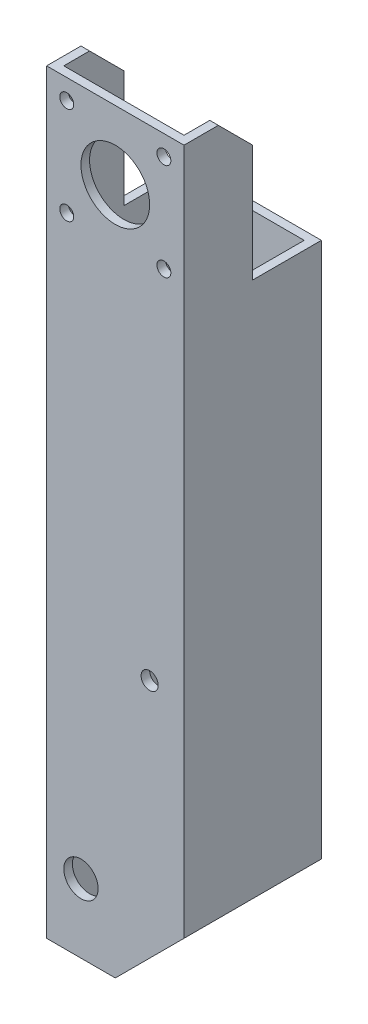
ISO-10303-21;
HEADER;
FILE_DESCRIPTION(('STEP AP214'),'2;1');
FILE_NAME('part.step','',(''),(''),'','','');
FILE_SCHEMA(('AUTOMOTIVE_DESIGN { 1 0 10303 214 1 1 1 1 }'));
ENDSEC;
DATA;
#1=APPLICATION_CONTEXT('core data for automotive mechanical design processes');
#2=APPLICATION_PROTOCOL_DEFINITION('international standard','automotive_design',2000,#1);
#3=PRODUCT_CONTEXT('',#1,'mechanical');
#4=PRODUCT('Part','Part','',(#3));
#5=PRODUCT_RELATED_PRODUCT_CATEGORY('part','',(#4));
#6=PRODUCT_DEFINITION_FORMATION('','',#4);
#7=PRODUCT_DEFINITION_CONTEXT('part definition',#1,'design');
#8=PRODUCT_DEFINITION('design','',#6,#7);
#9=PRODUCT_DEFINITION_SHAPE('','',#8);
#10=(LENGTH_UNIT() NAMED_UNIT(*) SI_UNIT(.MILLI.,.METRE.));
#11=(NAMED_UNIT(*) PLANE_ANGLE_UNIT() SI_UNIT($,.RADIAN.));
#12=(NAMED_UNIT(*) SI_UNIT($,.STERADIAN.) SOLID_ANGLE_UNIT());
#13=UNCERTAINTY_MEASURE_WITH_UNIT(LENGTH_MEASURE(1.E-05),#10,'distance_accuracy_value','');
#14=(GEOMETRIC_REPRESENTATION_CONTEXT(3) GLOBAL_UNCERTAINTY_ASSIGNED_CONTEXT((#13)) GLOBAL_UNIT_ASSIGNED_CONTEXT((#10,
#11,#12)) REPRESENTATION_CONTEXT('',''));
#15=CARTESIAN_POINT('',(0.,0.,0.));
#16=DIRECTION('',(0.,0.,1.));
#17=DIRECTION('',(1.,0.,0.));
#18=AXIS2_PLACEMENT_3D('',#15,#16,#17);
#19=CARTESIAN_POINT('',(0.,279.4,0.));
#20=DIRECTION('',(0.,-1.,0.));
#21=DIRECTION('',(0.,0.,-1.));
#22=AXIS2_PLACEMENT_3D('',#19,#20,#21);
#23=PLANE('',#22);
#24=DIRECTION('',(0.,0.,-1.));
#25=VECTOR('',#24,1.);
#26=CARTESIAN_POINT('',(50.8,279.4,0.));
#27=LINE('',#26,#25);
#28=CARTESIAN_POINT('',(50.8,279.4,0.));
#29=VERTEX_POINT('',#28);
#30=CARTESIAN_POINT('',(50.8,279.4,-12.7));
#31=VERTEX_POINT('',#30);
#32=EDGE_CURVE('E176',#29,#31,#27,.T.);
#33=ORIENTED_EDGE('',*,*,#32,.T.);
#34=DIRECTION('',(-1.,0.,0.));
#35=VECTOR('',#34,1.);
#36=CARTESIAN_POINT('',(0.,279.4,-12.7));
#37=LINE('',#36,#35);
#38=CARTESIAN_POINT('',(47.625,279.4,-12.7));
#39=VERTEX_POINT('',#38);
#40=EDGE_CURVE('E215',#31,#39,#37,.T.);
#41=ORIENTED_EDGE('',*,*,#40,.T.);
#42=DIRECTION('',(0.,0.,-1.));
#43=VECTOR('',#42,1.);
#44=CARTESIAN_POINT('',(47.625,279.4,-3.175));
#45=LINE('',#44,#43);
#46=CARTESIAN_POINT('',(47.625,279.4,-3.175));
#47=VERTEX_POINT('',#46);
#48=EDGE_CURVE('E245',#47,#39,#45,.T.);
#49=ORIENTED_EDGE('',*,*,#48,.F.);
#50=DIRECTION('',(1.,0.,0.));
#51=VECTOR('',#50,1.);
#52=CARTESIAN_POINT('',(3.175,279.4,-3.175));
#53=LINE('',#52,#51);
#54=CARTESIAN_POINT('',(3.175,279.4,-3.175));
#55=VERTEX_POINT('',#54);
#56=EDGE_CURVE('E275',#55,#47,#53,.T.);
#57=ORIENTED_EDGE('',*,*,#56,.F.);
#58=DIRECTION('',(0.,0.,1.));
#59=VECTOR('',#58,1.);
#60=CARTESIAN_POINT('',(3.175,279.4,-3.175));
#61=LINE('',#60,#59);
#62=CARTESIAN_POINT('',(3.175,279.4,-12.7));
#63=VERTEX_POINT('',#62);
#64=EDGE_CURVE('E279',#63,#55,#61,.T.);
#65=ORIENTED_EDGE('',*,*,#64,.F.);
#66=DIRECTION('',(-1.,0.,0.));
#67=VECTOR('',#66,1.);
#68=CARTESIAN_POINT('',(0.,279.4,-12.7));
#69=LINE('',#68,#67);
#70=CARTESIAN_POINT('',(0.,279.4,-12.7));
#71=VERTEX_POINT('',#70);
#72=EDGE_CURVE('E212',#63,#71,#69,.T.);
#73=ORIENTED_EDGE('',*,*,#72,.T.);
#74=DIRECTION('',(0.,0.,1.));
#75=VECTOR('',#74,1.);
#76=CARTESIAN_POINT('',(0.,279.4,0.));
#77=LINE('',#76,#75);
#78=CARTESIAN_POINT('',(0.,279.4,0.));
#79=VERTEX_POINT('',#78);
#80=EDGE_CURVE('E299',#71,#79,#77,.T.);
#81=ORIENTED_EDGE('',*,*,#80,.T.);
#82=DIRECTION('',(1.,0.,0.));
#83=VECTOR('',#82,1.);
#84=CARTESIAN_POINT('',(0.,279.4,0.));
#85=LINE('',#84,#83);
#86=EDGE_CURVE('E234',#79,#29,#85,.T.);
#87=ORIENTED_EDGE('',*,*,#86,.T.);
#88=EDGE_LOOP('',(#33,#41,#49,#57,#65,#73,#81,#87));
#89=FACE_BOUND('',#88,.T.);
#90=ADVANCED_FACE('F32',(#89),#23,.F.);
#91=CARTESIAN_POINT('',(0.,0.,0.));
#92=DIRECTION('',(0.,-1.,0.));
#93=DIRECTION('',(0.,0.,-1.));
#94=AXIS2_PLACEMENT_3D('',#91,#92,#93);
#95=PLANE('',#94);
#96=DIRECTION('',(-1.,0.,0.));
#97=VECTOR('',#96,1.);
#98=CARTESIAN_POINT('',(0.,0.,-50.8));
#99=LINE('',#98,#97);
#100=CARTESIAN_POINT('',(25.3999999999998,0.,-50.8));
#101=VERTEX_POINT('',#100);
#102=CARTESIAN_POINT('',(0.,0.,-50.8));
#103=VERTEX_POINT('',#102);
#104=EDGE_CURVE('E301',#101,#103,#99,.T.);
#105=ORIENTED_EDGE('',*,*,#104,.F.);
#106=DIRECTION('',(0.,0.,1.));
#107=VECTOR('',#106,1.);
#108=CARTESIAN_POINT('',(25.3999999999998,0.,0.));
#109=LINE('',#108,#107);
#110=CARTESIAN_POINT('',(25.3999999999998,0.,-47.625));
#111=VERTEX_POINT('',#110);
#112=EDGE_CURVE('E192',#101,#111,#109,.T.);
#113=ORIENTED_EDGE('',*,*,#112,.T.);
#114=DIRECTION('',(-1.,0.,0.));
#115=VECTOR('',#114,1.);
#116=CARTESIAN_POINT('',(3.175,0.,-47.625));
#117=LINE('',#116,#115);
#118=CARTESIAN_POINT('',(3.175,0.,-47.625));
#119=VERTEX_POINT('',#118);
#120=EDGE_CURVE('E284',#111,#119,#117,.T.);
#121=ORIENTED_EDGE('',*,*,#120,.T.);
#122=DIRECTION('',(0.,0.,1.));
#123=VECTOR('',#122,1.);
#124=CARTESIAN_POINT('',(3.175,0.,-3.175));
#125=LINE('',#124,#123);
#126=CARTESIAN_POINT('',(3.175,0.,-3.175));
#127=VERTEX_POINT('',#126);
#128=EDGE_CURVE('E277',#119,#127,#125,.T.);
#129=ORIENTED_EDGE('',*,*,#128,.T.);
#130=DIRECTION('',(1.,0.,0.));
#131=VECTOR('',#130,1.);
#132=CARTESIAN_POINT('',(3.175,0.,-3.175));
#133=LINE('',#132,#131);
#134=CARTESIAN_POINT('',(25.3999999999998,0.,-3.175));
#135=VERTEX_POINT('',#134);
#136=EDGE_CURVE('E274',#127,#135,#133,.T.);
#137=ORIENTED_EDGE('',*,*,#136,.T.);
#138=DIRECTION('',(0.,0.,1.));
#139=VECTOR('',#138,1.);
#140=CARTESIAN_POINT('',(25.3999999999998,0.,0.));
#141=LINE('',#140,#139);
#142=CARTESIAN_POINT('',(25.3999999999998,0.,0.));
#143=VERTEX_POINT('',#142);
#144=EDGE_CURVE('E190',#135,#143,#141,.T.);
#145=ORIENTED_EDGE('',*,*,#144,.T.);
#146=DIRECTION('',(1.,0.,0.));
#147=VECTOR('',#146,1.);
#148=CARTESIAN_POINT('',(0.,0.,0.));
#149=LINE('',#148,#147);
#150=CARTESIAN_POINT('',(0.,0.,0.));
#151=VERTEX_POINT('',#150);
#152=EDGE_CURVE('E305',#151,#143,#149,.T.);
#153=ORIENTED_EDGE('',*,*,#152,.F.);
#154=DIRECTION('',(0.,0.,1.));
#155=VECTOR('',#154,1.);
#156=CARTESIAN_POINT('',(0.,0.,0.));
#157=LINE('',#156,#155);
#158=EDGE_CURVE('E298',#103,#151,#157,.T.);
#159=ORIENTED_EDGE('',*,*,#158,.F.);
#160=EDGE_LOOP('',(#105,#113,#121,#129,#137,#145,#153,#159));
#161=FACE_BOUND('',#160,.T.);
#162=ADVANCED_FACE('F311',(#161),#95,.T.);
#163=CARTESIAN_POINT('',(0.,279.4,0.));
#164=DIRECTION('',(1.,0.,0.));
#165=DIRECTION('',(0.,0.,-1.));
#166=AXIS2_PLACEMENT_3D('',#163,#164,#165);
#167=PLANE('',#166);
#168=ORIENTED_EDGE('',*,*,#80,.F.);
#169=DIRECTION('',(0.,0.707106781186549,0.707106781186546));
#170=VECTOR('',#169,1.);
#171=CARTESIAN_POINT('',(0.,279.4,-12.7));
#172=LINE('',#171,#170);
#173=CARTESIAN_POINT('',(0.,266.7,-25.4));
#174=VERTEX_POINT('',#173);
#175=EDGE_CURVE('E54',#71,#174,#172,.F.);
#176=ORIENTED_EDGE('',*,*,#175,.T.);
#177=DIRECTION('',(0.,1.,0.));
#178=VECTOR('',#177,1.);
#179=CARTESIAN_POINT('',(0.,279.4,-25.4));
#180=LINE('',#179,#178);
#181=CARTESIAN_POINT('',(0.,223.52,-25.4));
#182=VERTEX_POINT('',#181);
#183=EDGE_CURVE('E156',#182,#174,#180,.T.);
#184=ORIENTED_EDGE('',*,*,#183,.F.);
#185=DIRECTION('',(0.,0.,1.));
#186=VECTOR('',#185,1.);
#187=CARTESIAN_POINT('',(0.,223.52,-50.8));
#188=LINE('',#187,#186);
#189=CARTESIAN_POINT('',(0.,223.52,-50.8));
#190=VERTEX_POINT('',#189);
#191=EDGE_CURVE('E314',#190,#182,#188,.T.);
#192=ORIENTED_EDGE('',*,*,#191,.F.);
#193=DIRECTION('',(0.,-1.,0.));
#194=VECTOR('',#193,1.);
#195=CARTESIAN_POINT('',(0.,279.4,-50.8));
#196=LINE('',#195,#194);
#197=EDGE_CURVE('E164',#190,#103,#196,.T.);
#198=ORIENTED_EDGE('',*,*,#197,.T.);
#199=ORIENTED_EDGE('',*,*,#158,.T.);
#200=DIRECTION('',(0.,-1.,0.));
#201=VECTOR('',#200,1.);
#202=CARTESIAN_POINT('',(0.,279.4,0.));
#203=LINE('',#202,#201);
#204=EDGE_CURVE('E174',#79,#151,#203,.T.);
#205=ORIENTED_EDGE('',*,*,#204,.F.);
#206=EDGE_LOOP('',(#168,#176,#184,#192,#198,#199,#205));
#207=FACE_BOUND('',#206,.T.);
#208=ADVANCED_FACE('F313',(#207),#167,.F.);
#209=CARTESIAN_POINT('',(0.,279.4,0.));
#210=DIRECTION('',(0.,0.,-1.));
#211=DIRECTION('',(-1.,0.,0.));
#212=AXIS2_PLACEMENT_3D('',#209,#210,#211);
#213=PLANE('',#212);
#214=CARTESIAN_POINT('',(7.43948775786172,236.039487757862,0.));
#215=DIRECTION('',(0.,0.,1.));
#216=DIRECTION('',(1.,0.,0.));
#217=AXIS2_PLACEMENT_3D('',#214,#215,#216);
#218=CIRCLE('',#217,2.5796875);
#219=CARTESIAN_POINT('',(10.0191752578617,236.039487757862,0.));
#220=VERTEX_POINT('',#219);
#221=EDGE_CURVE('E415',#220,#220,#218,.T.);
#222=ORIENTED_EDGE('',*,*,#221,.F.);
#223=EDGE_LOOP('',(#222));
#224=FACE_BOUND('',#223,.T.);
#225=CARTESIAN_POINT('',(43.3605122421383,236.039487757862,0.));
#226=DIRECTION('',(0.,0.,1.));
#227=DIRECTION('',(1.,0.,0.));
#228=AXIS2_PLACEMENT_3D('',#225,#226,#227);
#229=CIRCLE('',#228,2.57968749999999);
#230=CARTESIAN_POINT('',(45.9401997421383,236.039487757862,0.));
#231=VERTEX_POINT('',#230);
#232=EDGE_CURVE('E419',#231,#231,#229,.T.);
#233=ORIENTED_EDGE('',*,*,#232,.F.);
#234=EDGE_LOOP('',(#233));
#235=FACE_BOUND('',#234,.T.);
#236=CARTESIAN_POINT('',(43.3605122421384,271.960512242138,0.));
#237=DIRECTION('',(0.,0.,1.));
#238=DIRECTION('',(1.,0.,0.));
#239=AXIS2_PLACEMENT_3D('',#236,#237,#238);
#240=CIRCLE('',#239,2.57968749999999);
#241=CARTESIAN_POINT('',(45.9401997421384,271.960512242138,0.));
#242=VERTEX_POINT('',#241);
#243=EDGE_CURVE('E427',#242,#242,#240,.T.);
#244=ORIENTED_EDGE('',*,*,#243,.F.);
#245=EDGE_LOOP('',(#244));
#246=FACE_BOUND('',#245,.T.);
#247=CARTESIAN_POINT('',(7.43948775786173,271.960512242138,0.));
#248=DIRECTION('',(0.,0.,1.));
#249=DIRECTION('',(1.,0.,0.));
#250=AXIS2_PLACEMENT_3D('',#247,#248,#249);
#251=CIRCLE('',#250,2.5796875);
#252=CARTESIAN_POINT('',(10.0191752578617,271.960512242138,0.));
#253=VERTEX_POINT('',#252);
#254=EDGE_CURVE('E316',#253,#253,#251,.T.);
#255=ORIENTED_EDGE('',*,*,#254,.F.);
#256=EDGE_LOOP('',(#255));
#257=FACE_BOUND('',#256,.T.);
#258=CARTESIAN_POINT('',(38.1,101.6,0.));
#259=DIRECTION('',(0.,0.,-1.));
#260=DIRECTION('',(-1.,0.,0.));
#261=AXIS2_PLACEMENT_3D('',#258,#259,#260);
#262=CIRCLE('',#261,3.175);
#263=CARTESIAN_POINT('',(34.925,101.6,0.));
#264=VERTEX_POINT('',#263);
#265=EDGE_CURVE('E208',#264,#264,#262,.T.);
#266=ORIENTED_EDGE('',*,*,#265,.T.);
#267=EDGE_LOOP('',(#266));
#268=FACE_BOUND('',#267,.T.);
#269=CARTESIAN_POINT('',(25.4,254.,0.));
#270=DIRECTION('',(0.,0.,-1.));
#271=DIRECTION('',(-1.,0.,0.));
#272=AXIS2_PLACEMENT_3D('',#269,#270,#271);
#273=CIRCLE('',#272,12.7);
#274=CARTESIAN_POINT('',(12.7,254.,0.));
#275=VERTEX_POINT('',#274);
#276=EDGE_CURVE('E261',#275,#275,#273,.T.);
#277=ORIENTED_EDGE('',*,*,#276,.T.);
#278=EDGE_LOOP('',(#277));
#279=FACE_BOUND('',#278,.T.);
#280=CARTESIAN_POINT('',(12.7,25.4,0.));
#281=DIRECTION('',(0.,0.,-1.));
#282=DIRECTION('',(-1.,0.,0.));
#283=AXIS2_PLACEMENT_3D('',#280,#281,#282);
#284=CIRCLE('',#283,6.35);
#285=CARTESIAN_POINT('',(6.34999999999999,25.4,0.));
#286=VERTEX_POINT('',#285);
#287=EDGE_CURVE('E186',#286,#286,#284,.T.);
#288=ORIENTED_EDGE('',*,*,#287,.T.);
#289=EDGE_LOOP('',(#288));
#290=FACE_BOUND('',#289,.T.);
#291=ORIENTED_EDGE('',*,*,#152,.T.);
#292=DIRECTION('',(0.707106781186544,0.707106781186551,0.));
#293=VECTOR('',#292,1.);
#294=CARTESIAN_POINT('',(50.8,25.4000000000004,0.));
#295=LINE('',#294,#293);
#296=CARTESIAN_POINT('',(50.8,25.4000000000004,0.));
#297=VERTEX_POINT('',#296);
#298=EDGE_CURVE('E201',#143,#297,#295,.T.);
#299=ORIENTED_EDGE('',*,*,#298,.T.);
#300=DIRECTION('',(0.,-1.,0.));
#301=VECTOR('',#300,1.);
#302=CARTESIAN_POINT('',(50.8,279.4,0.));
#303=LINE('',#302,#301);
#304=EDGE_CURVE('E172',#29,#297,#303,.T.);
#305=ORIENTED_EDGE('',*,*,#304,.F.);
#306=ORIENTED_EDGE('',*,*,#86,.F.);
#307=ORIENTED_EDGE('',*,*,#204,.T.);
#308=EDGE_LOOP('',(#291,#299,#305,#306,#307));
#309=FACE_BOUND('',#308,.T.);
#310=ADVANCED_FACE('F374',(#224,#235,#246,#257,#268,#279,#290,#309),#213,.F.);
#311=CARTESIAN_POINT('',(50.8,279.4,0.));
#312=DIRECTION('',(-1.,0.,0.));
#313=DIRECTION('',(0.,0.,1.));
#314=AXIS2_PLACEMENT_3D('',#311,#312,#313);
#315=PLANE('',#314);
#316=DIRECTION('',(0.,1.,0.));
#317=VECTOR('',#316,1.);
#318=CARTESIAN_POINT('',(50.8,279.4,-25.4));
#319=LINE('',#318,#317);
#320=CARTESIAN_POINT('',(50.8,223.52,-25.4));
#321=VERTEX_POINT('',#320);
#322=CARTESIAN_POINT('',(50.8,266.7,-25.4));
#323=VERTEX_POINT('',#322);
#324=EDGE_CURVE('E155',#321,#323,#319,.T.);
#325=ORIENTED_EDGE('',*,*,#324,.T.);
#326=DIRECTION('',(0.,-0.707106781186549,-0.707106781186546));
#327=VECTOR('',#326,1.);
#328=CARTESIAN_POINT('',(50.8,279.4,-12.7));
#329=LINE('',#328,#327);
#330=EDGE_CURVE('E222',#323,#31,#329,.F.);
#331=ORIENTED_EDGE('',*,*,#330,.T.);
#332=ORIENTED_EDGE('',*,*,#32,.F.);
#333=ORIENTED_EDGE('',*,*,#304,.T.);
#334=DIRECTION('',(0.,0.,-1.));
#335=VECTOR('',#334,1.);
#336=CARTESIAN_POINT('',(50.8,25.4000000000004,-50.8));
#337=LINE('',#336,#335);
#338=CARTESIAN_POINT('',(50.8,25.4000000000004,-50.8));
#339=VERTEX_POINT('',#338);
#340=EDGE_CURVE('E171',#297,#339,#337,.T.);
#341=ORIENTED_EDGE('',*,*,#340,.T.);
#342=DIRECTION('',(0.,-1.,0.));
#343=VECTOR('',#342,1.);
#344=CARTESIAN_POINT('',(50.8,279.4,-50.8));
#345=LINE('',#344,#343);
#346=CARTESIAN_POINT('',(50.8,223.52,-50.8));
#347=VERTEX_POINT('',#346);
#348=EDGE_CURVE('E161',#347,#339,#345,.T.);
#349=ORIENTED_EDGE('',*,*,#348,.F.);
#350=DIRECTION('',(0.,0.,1.));
#351=VECTOR('',#350,1.);
#352=CARTESIAN_POINT('',(50.8,223.52,-50.8));
#353=LINE('',#352,#351);
#354=EDGE_CURVE('E143',#347,#321,#353,.T.);
#355=ORIENTED_EDGE('',*,*,#354,.T.);
#356=EDGE_LOOP('',(#325,#331,#332,#333,#341,#349,#355));
#357=FACE_BOUND('',#356,.T.);
#358=ADVANCED_FACE('F168',(#357),#315,.F.);
#359=CARTESIAN_POINT('',(0.,279.4,-50.8));
#360=DIRECTION('',(0.,0.,1.));
#361=DIRECTION('',(1.,0.,0.));
#362=AXIS2_PLACEMENT_3D('',#359,#360,#361);
#363=PLANE('',#362);
#364=CARTESIAN_POINT('',(38.1,101.6,-50.8));
#365=DIRECTION('',(0.,0.,-1.));
#366=DIRECTION('',(-1.,0.,0.));
#367=AXIS2_PLACEMENT_3D('',#364,#365,#366);
#368=CIRCLE('',#367,3.175);
#369=CARTESIAN_POINT('',(34.925,101.6,-50.8));
#370=VERTEX_POINT('',#369);
#371=EDGE_CURVE('E248',#370,#370,#368,.T.);
#372=ORIENTED_EDGE('',*,*,#371,.F.);
#373=EDGE_LOOP('',(#372));
#374=FACE_BOUND('',#373,.T.);
#375=CARTESIAN_POINT('',(12.7,25.4,-50.8));
#376=DIRECTION('',(0.,0.,-1.));
#377=DIRECTION('',(-1.,0.,0.));
#378=AXIS2_PLACEMENT_3D('',#375,#376,#377);
#379=CIRCLE('',#378,6.35);
#380=CARTESIAN_POINT('',(6.34999999999999,25.4,-50.8));
#381=VERTEX_POINT('',#380);
#382=EDGE_CURVE('E267',#381,#381,#379,.T.);
#383=ORIENTED_EDGE('',*,*,#382,.F.);
#384=EDGE_LOOP('',(#383));
#385=FACE_BOUND('',#384,.T.);
#386=ORIENTED_EDGE('',*,*,#197,.F.);
#387=DIRECTION('',(-1.,0.,0.));
#388=VECTOR('',#387,1.);
#389=CARTESIAN_POINT('',(50.8,223.52,-50.8));
#390=LINE('',#389,#388);
#391=EDGE_CURVE('E147',#347,#190,#390,.T.);
#392=ORIENTED_EDGE('',*,*,#391,.F.);
#393=ORIENTED_EDGE('',*,*,#348,.T.);
#394=DIRECTION('',(-0.707106781186544,-0.707106781186551,0.));
#395=VECTOR('',#394,1.);
#396=CARTESIAN_POINT('',(50.8,25.4000000000004,-50.8));
#397=LINE('',#396,#395);
#398=EDGE_CURVE('E188',#339,#101,#397,.T.);
#399=ORIENTED_EDGE('',*,*,#398,.T.);
#400=ORIENTED_EDGE('',*,*,#104,.T.);
#401=EDGE_LOOP('',(#386,#392,#393,#399,#400));
#402=FACE_BOUND('',#401,.T.);
#403=ADVANCED_FACE('F160',(#374,#385,#402),#363,.F.);
#404=CARTESIAN_POINT('',(3.175,279.4,-3.175));
#405=DIRECTION('',(0.,0.,-1.));
#406=DIRECTION('',(-1.,0.,0.));
#407=AXIS2_PLACEMENT_3D('',#404,#405,#406);
#408=PLANE('',#407);
#409=CARTESIAN_POINT('',(7.43948775786172,236.039487757862,-3.175));
#410=DIRECTION('',(0.,0.,-1.));
#411=DIRECTION('',(-1.,0.,0.));
#412=AXIS2_PLACEMENT_3D('',#409,#410,#411);
#413=CIRCLE('',#412,2.5796875);
#414=CARTESIAN_POINT('',(4.85980025786172,236.039487757862,-3.175));
#415=VERTEX_POINT('',#414);
#416=EDGE_CURVE('E412',#415,#415,#413,.F.);
#417=ORIENTED_EDGE('',*,*,#416,.T.);
#418=EDGE_LOOP('',(#417));
#419=FACE_BOUND('',#418,.T.);
#420=CARTESIAN_POINT('',(43.3605122421383,236.039487757862,-3.175));
#421=DIRECTION('',(0.,0.,-1.));
#422=DIRECTION('',(-1.,0.,0.));
#423=AXIS2_PLACEMENT_3D('',#420,#421,#422);
#424=CIRCLE('',#423,2.57968749999999);
#425=CARTESIAN_POINT('',(40.7808247421383,236.039487757862,-3.175));
#426=VERTEX_POINT('',#425);
#427=EDGE_CURVE('E424',#426,#426,#424,.F.);
#428=ORIENTED_EDGE('',*,*,#427,.T.);
#429=EDGE_LOOP('',(#428));
#430=FACE_BOUND('',#429,.T.);
#431=CARTESIAN_POINT('',(43.3605122421384,271.960512242138,-3.175));
#432=DIRECTION('',(0.,0.,-1.));
#433=DIRECTION('',(-1.,0.,0.));
#434=AXIS2_PLACEMENT_3D('',#431,#432,#433);
#435=CIRCLE('',#434,2.57968749999999);
#436=CARTESIAN_POINT('',(40.7808247421384,271.960512242138,-3.175));
#437=VERTEX_POINT('',#436);
#438=EDGE_CURVE('E430',#437,#437,#435,.F.);
#439=ORIENTED_EDGE('',*,*,#438,.T.);
#440=EDGE_LOOP('',(#439));
#441=FACE_BOUND('',#440,.T.);
#442=CARTESIAN_POINT('',(7.43948775786173,271.960512242138,-3.175));
#443=DIRECTION('',(0.,0.,-1.));
#444=DIRECTION('',(-1.,0.,0.));
#445=AXIS2_PLACEMENT_3D('',#442,#443,#444);
#446=CIRCLE('',#445,2.5796875);
#447=CARTESIAN_POINT('',(4.85980025786174,271.960512242138,-3.175));
#448=VERTEX_POINT('',#447);
#449=EDGE_CURVE('E320',#448,#448,#446,.F.);
#450=ORIENTED_EDGE('',*,*,#449,.T.);
#451=EDGE_LOOP('',(#450));
#452=FACE_BOUND('',#451,.T.);
#453=CARTESIAN_POINT('',(38.1,101.6,-3.175));
#454=DIRECTION('',(0.,0.,-1.));
#455=DIRECTION('',(-1.,0.,0.));
#456=AXIS2_PLACEMENT_3D('',#453,#454,#455);
#457=CIRCLE('',#456,3.175);
#458=CARTESIAN_POINT('',(34.925,101.6,-3.175));
#459=VERTEX_POINT('',#458);
#460=EDGE_CURVE('E207',#459,#459,#457,.T.);
#461=ORIENTED_EDGE('',*,*,#460,.F.);
#462=EDGE_LOOP('',(#461));
#463=FACE_BOUND('',#462,.T.);
#464=CARTESIAN_POINT('',(25.4,254.,-3.175));
#465=DIRECTION('',(0.,0.,-1.));
#466=DIRECTION('',(-1.,0.,0.));
#467=AXIS2_PLACEMENT_3D('',#464,#465,#466);
#468=CIRCLE('',#467,12.7);
#469=CARTESIAN_POINT('',(12.7,254.,-3.175));
#470=VERTEX_POINT('',#469);
#471=EDGE_CURVE('E264',#470,#470,#468,.T.);
#472=ORIENTED_EDGE('',*,*,#471,.F.);
#473=EDGE_LOOP('',(#472));
#474=FACE_BOUND('',#473,.T.);
#475=CARTESIAN_POINT('',(12.7,25.4,-3.175));
#476=DIRECTION('',(0.,0.,-1.));
#477=DIRECTION('',(-1.,0.,0.));
#478=AXIS2_PLACEMENT_3D('',#475,#476,#477);
#479=CIRCLE('',#478,6.35);
#480=CARTESIAN_POINT('',(6.34999999999999,25.4,-3.175));
#481=VERTEX_POINT('',#480);
#482=EDGE_CURVE('E185',#481,#481,#479,.T.);
#483=ORIENTED_EDGE('',*,*,#482,.F.);
#484=EDGE_LOOP('',(#483));
#485=FACE_BOUND('',#484,.T.);
#486=DIRECTION('',(0.,-1.,0.));
#487=VECTOR('',#486,1.);
#488=CARTESIAN_POINT('',(47.625,279.4,-3.175));
#489=LINE('',#488,#487);
#490=CARTESIAN_POINT('',(47.625,22.2250000000004,-3.175));
#491=VERTEX_POINT('',#490);
#492=EDGE_CURVE('E295',#47,#491,#489,.T.);
#493=ORIENTED_EDGE('',*,*,#492,.T.);
#494=DIRECTION('',(-0.707106781186544,-0.707106781186551,0.));
#495=VECTOR('',#494,1.);
#496=CARTESIAN_POINT('',(153.9875,128.587500000001,-3.175));
#497=LINE('',#496,#495);
#498=EDGE_CURVE('E199',#491,#135,#497,.T.);
#499=ORIENTED_EDGE('',*,*,#498,.T.);
#500=ORIENTED_EDGE('',*,*,#136,.F.);
#501=DIRECTION('',(0.,-1.,0.));
#502=VECTOR('',#501,1.);
#503=CARTESIAN_POINT('',(3.175,279.4,-3.175));
#504=LINE('',#503,#502);
#505=EDGE_CURVE('E281',#55,#127,#504,.T.);
#506=ORIENTED_EDGE('',*,*,#505,.F.);
#507=ORIENTED_EDGE('',*,*,#56,.T.);
#508=EDGE_LOOP('',(#493,#499,#500,#506,#507));
#509=FACE_BOUND('',#508,.T.);
#510=ADVANCED_FACE('F339',(#419,#430,#441,#452,#463,#474,#485,#509),#408,.T.);
#511=CARTESIAN_POINT('',(47.625,279.4,-3.175));
#512=DIRECTION('',(-1.,0.,0.));
#513=DIRECTION('',(0.,0.,1.));
#514=AXIS2_PLACEMENT_3D('',#511,#512,#513);
#515=PLANE('',#514);
#516=ORIENTED_EDGE('',*,*,#48,.T.);
#517=DIRECTION('',(0.,0.707106781186549,0.707106781186546));
#518=VECTOR('',#517,1.);
#519=CARTESIAN_POINT('',(47.625,284.1625,-7.93750000000003));
#520=LINE('',#519,#518);
#521=CARTESIAN_POINT('',(47.625,266.7,-25.4));
#522=VERTEX_POINT('',#521);
#523=EDGE_CURVE('E218',#39,#522,#520,.F.);
#524=ORIENTED_EDGE('',*,*,#523,.T.);
#525=DIRECTION('',(0.,1.,0.));
#526=VECTOR('',#525,1.);
#527=CARTESIAN_POINT('',(47.625,279.4,-25.4));
#528=LINE('',#527,#526);
#529=CARTESIAN_POINT('',(47.625,223.52,-25.4));
#530=VERTEX_POINT('',#529);
#531=EDGE_CURVE('E243',#530,#522,#528,.T.);
#532=ORIENTED_EDGE('',*,*,#531,.F.);
#533=DIRECTION('',(0.,0.,1.));
#534=VECTOR('',#533,1.);
#535=CARTESIAN_POINT('',(47.625,223.52,-3.175));
#536=LINE('',#535,#534);
#537=CARTESIAN_POINT('',(47.625,223.52,-47.625));
#538=VERTEX_POINT('',#537);
#539=EDGE_CURVE('E249',#538,#530,#536,.T.);
#540=ORIENTED_EDGE('',*,*,#539,.F.);
#541=DIRECTION('',(0.,-1.,0.));
#542=VECTOR('',#541,1.);
#543=CARTESIAN_POINT('',(47.625,279.4,-47.625));
#544=LINE('',#543,#542);
#545=CARTESIAN_POINT('',(47.625,22.2250000000004,-47.625));
#546=VERTEX_POINT('',#545);
#547=EDGE_CURVE('E293',#538,#546,#544,.T.);
#548=ORIENTED_EDGE('',*,*,#547,.T.);
#549=DIRECTION('',(0.,0.,1.));
#550=VECTOR('',#549,1.);
#551=CARTESIAN_POINT('',(47.625,22.2250000000004,-3.175));
#552=LINE('',#551,#550);
#553=EDGE_CURVE('E197',#546,#491,#552,.T.);
#554=ORIENTED_EDGE('',*,*,#553,.T.);
#555=ORIENTED_EDGE('',*,*,#492,.F.);
#556=EDGE_LOOP('',(#516,#524,#532,#540,#548,#554,#555));
#557=FACE_BOUND('',#556,.T.);
#558=ADVANCED_FACE('F241',(#557),#515,.T.);
#559=CARTESIAN_POINT('',(3.175,279.4,-47.625));
#560=DIRECTION('',(0.,0.,1.));
#561=DIRECTION('',(1.,0.,0.));
#562=AXIS2_PLACEMENT_3D('',#559,#560,#561);
#563=PLANE('',#562);
#564=DIRECTION('',(1.,0.,0.));
#565=VECTOR('',#564,1.);
#566=CARTESIAN_POINT('',(3.175,223.52,-47.625));
#567=LINE('',#566,#565);
#568=CARTESIAN_POINT('',(3.175,223.52,-47.625));
#569=VERTEX_POINT('',#568);
#570=EDGE_CURVE('E253',#569,#538,#567,.T.);
#571=ORIENTED_EDGE('',*,*,#570,.F.);
#572=DIRECTION('',(0.,-1.,0.));
#573=VECTOR('',#572,1.);
#574=CARTESIAN_POINT('',(3.175,279.4,-47.625));
#575=LINE('',#574,#573);
#576=EDGE_CURVE('E291',#569,#119,#575,.T.);
#577=ORIENTED_EDGE('',*,*,#576,.T.);
#578=ORIENTED_EDGE('',*,*,#120,.F.);
#579=DIRECTION('',(0.707106781186544,0.707106781186551,0.));
#580=VECTOR('',#579,1.);
#581=CARTESIAN_POINT('',(153.9875,128.587500000001,-47.625));
#582=LINE('',#581,#580);
#583=EDGE_CURVE('E194',#111,#546,#582,.T.);
#584=ORIENTED_EDGE('',*,*,#583,.T.);
#585=ORIENTED_EDGE('',*,*,#547,.F.);
#586=EDGE_LOOP('',(#571,#577,#578,#584,#585));
#587=FACE_BOUND('',#586,.T.);
#588=CARTESIAN_POINT('',(38.1,101.6,-47.625));
#589=DIRECTION('',(0.,0.,1.));
#590=DIRECTION('',(1.,0.,0.));
#591=AXIS2_PLACEMENT_3D('',#588,#589,#590);
#592=CIRCLE('',#591,3.175);
#593=CARTESIAN_POINT('',(41.275,101.6,-47.625));
#594=VERTEX_POINT('',#593);
#595=EDGE_CURVE('E204',#594,#594,#592,.T.);
#596=ORIENTED_EDGE('',*,*,#595,.F.);
#597=EDGE_LOOP('',(#596));
#598=FACE_BOUND('',#597,.T.);
#599=CARTESIAN_POINT('',(12.7,25.4,-47.625));
#600=DIRECTION('',(0.,0.,1.));
#601=DIRECTION('',(1.,0.,0.));
#602=AXIS2_PLACEMENT_3D('',#599,#600,#601);
#603=CIRCLE('',#602,6.35);
#604=CARTESIAN_POINT('',(19.05,25.4,-47.625));
#605=VERTEX_POINT('',#604);
#606=EDGE_CURVE('E182',#605,#605,#603,.T.);
#607=ORIENTED_EDGE('',*,*,#606,.F.);
#608=EDGE_LOOP('',(#607));
#609=FACE_BOUND('',#608,.T.);
#610=ADVANCED_FACE('F329',(#587,#598,#609),#563,.T.);
#611=CARTESIAN_POINT('',(3.175,279.4,-3.175));
#612=DIRECTION('',(1.,0.,0.));
#613=DIRECTION('',(0.,0.,-1.));
#614=AXIS2_PLACEMENT_3D('',#611,#612,#613);
#615=PLANE('',#614);
#616=DIRECTION('',(0.,-1.,0.));
#617=VECTOR('',#616,1.);
#618=CARTESIAN_POINT('',(3.175,279.4,-25.4));
#619=LINE('',#618,#617);
#620=CARTESIAN_POINT('',(3.175,266.7,-25.4));
#621=VERTEX_POINT('',#620);
#622=CARTESIAN_POINT('',(3.175,223.52,-25.4));
#623=VERTEX_POINT('',#622);
#624=EDGE_CURVE('E210',#621,#623,#619,.T.);
#625=ORIENTED_EDGE('',*,*,#624,.F.);
#626=DIRECTION('',(0.,-0.707106781186549,-0.707106781186546));
#627=VECTOR('',#626,1.);
#628=CARTESIAN_POINT('',(3.175,284.1625,-7.93750000000003));
#629=LINE('',#628,#627);
#630=EDGE_CURVE('E11',#621,#63,#629,.F.);
#631=ORIENTED_EDGE('',*,*,#630,.T.);
#632=ORIENTED_EDGE('',*,*,#64,.T.);
#633=ORIENTED_EDGE('',*,*,#505,.T.);
#634=ORIENTED_EDGE('',*,*,#128,.F.);
#635=ORIENTED_EDGE('',*,*,#576,.F.);
#636=DIRECTION('',(0.,0.,-1.));
#637=VECTOR('',#636,1.);
#638=CARTESIAN_POINT('',(3.175,223.52,-3.175));
#639=LINE('',#638,#637);
#640=EDGE_CURVE('E203',#623,#569,#639,.T.);
#641=ORIENTED_EDGE('',*,*,#640,.F.);
#642=EDGE_LOOP('',(#625,#631,#632,#633,#634,#635,#641));
#643=FACE_BOUND('',#642,.T.);
#644=ADVANCED_FACE('F347',(#643),#615,.T.);
#645=CARTESIAN_POINT('',(12.7,25.4,0.));
#646=DIRECTION('',(0.,0.,-1.));
#647=DIRECTION('',(-1.,0.,0.));
#648=AXIS2_PLACEMENT_3D('',#645,#646,#647);
#649=CYLINDRICAL_SURFACE('',#648,6.35);
#650=ORIENTED_EDGE('',*,*,#606,.T.);
#651=EDGE_LOOP('',(#650));
#652=FACE_BOUND('',#651,.T.);
#653=ORIENTED_EDGE('',*,*,#382,.T.);
#654=EDGE_LOOP('',(#653));
#655=FACE_BOUND('',#654,.T.);
#656=ADVANCED_FACE('F452',(#652,#655),#649,.F.);
#657=ORIENTED_EDGE('',*,*,#482,.T.);
#658=EDGE_LOOP('',(#657));
#659=FACE_BOUND('',#658,.T.);
#660=ORIENTED_EDGE('',*,*,#287,.F.);
#661=EDGE_LOOP('',(#660));
#662=FACE_BOUND('',#661,.T.);
#663=ADVANCED_FACE('F450',(#659,#662),#649,.F.);
#664=CARTESIAN_POINT('',(25.4,254.,0.));
#665=DIRECTION('',(0.,0.,-1.));
#666=DIRECTION('',(-1.,0.,0.));
#667=AXIS2_PLACEMENT_3D('',#664,#665,#666);
#668=CYLINDRICAL_SURFACE('',#667,12.7);
#669=ORIENTED_EDGE('',*,*,#471,.T.);
#670=EDGE_LOOP('',(#669));
#671=FACE_BOUND('',#670,.T.);
#672=ORIENTED_EDGE('',*,*,#276,.F.);
#673=EDGE_LOOP('',(#672));
#674=FACE_BOUND('',#673,.T.);
#675=ADVANCED_FACE('F381',(#671,#674),#668,.F.);
#676=CARTESIAN_POINT('',(50.8,25.4000000000004,0.));
#677=DIRECTION('',(0.707106781186551,-0.707106781186544,0.));
#678=DIRECTION('',(0.,0.,1.));
#679=AXIS2_PLACEMENT_3D('',#676,#677,#678);
#680=PLANE('',#679);
#681=ORIENTED_EDGE('',*,*,#583,.F.);
#682=ORIENTED_EDGE('',*,*,#112,.F.);
#683=ORIENTED_EDGE('',*,*,#398,.F.);
#684=ORIENTED_EDGE('',*,*,#340,.F.);
#685=ORIENTED_EDGE('',*,*,#298,.F.);
#686=ORIENTED_EDGE('',*,*,#144,.F.);
#687=ORIENTED_EDGE('',*,*,#498,.F.);
#688=ORIENTED_EDGE('',*,*,#553,.F.);
#689=EDGE_LOOP('',(#681,#682,#683,#684,#685,#686,#687,#688));
#690=FACE_BOUND('',#689,.T.);
#691=ADVANCED_FACE('F336',(#690),#680,.T.);
#692=CARTESIAN_POINT('',(38.1,101.6,0.));
#693=DIRECTION('',(0.,0.,-1.));
#694=DIRECTION('',(-1.,0.,0.));
#695=AXIS2_PLACEMENT_3D('',#692,#693,#694);
#696=CYLINDRICAL_SURFACE('',#695,3.175);
#697=ORIENTED_EDGE('',*,*,#595,.T.);
#698=EDGE_LOOP('',(#697));
#699=FACE_BOUND('',#698,.T.);
#700=ORIENTED_EDGE('',*,*,#371,.T.);
#701=EDGE_LOOP('',(#700));
#702=FACE_BOUND('',#701,.T.);
#703=ADVANCED_FACE('F380',(#699,#702),#696,.F.);
#704=ORIENTED_EDGE('',*,*,#460,.T.);
#705=EDGE_LOOP('',(#704));
#706=FACE_BOUND('',#705,.T.);
#707=ORIENTED_EDGE('',*,*,#265,.F.);
#708=EDGE_LOOP('',(#707));
#709=FACE_BOUND('',#708,.T.);
#710=ADVANCED_FACE('F356',(#706,#709),#696,.F.);
#711=CARTESIAN_POINT('',(50.8,279.4,-25.4));
#712=DIRECTION('',(0.,0.,1.));
#713=DIRECTION('',(0.,-1.,0.));
#714=AXIS2_PLACEMENT_3D('',#711,#712,#713);
#715=PLANE('',#714);
#716=ORIENTED_EDGE('',*,*,#531,.T.);
#717=DIRECTION('',(1.,0.,0.));
#718=VECTOR('',#717,1.);
#719=CARTESIAN_POINT('',(50.8,266.7,-25.4));
#720=LINE('',#719,#718);
#721=EDGE_CURVE('E220',#522,#323,#720,.T.);
#722=ORIENTED_EDGE('',*,*,#721,.T.);
#723=ORIENTED_EDGE('',*,*,#324,.F.);
#724=DIRECTION('',(-1.,0.,0.));
#725=VECTOR('',#724,1.);
#726=CARTESIAN_POINT('',(50.8,223.52,-25.4));
#727=LINE('',#726,#725);
#728=EDGE_CURVE('E150',#321,#530,#727,.T.);
#729=ORIENTED_EDGE('',*,*,#728,.T.);
#730=EDGE_LOOP('',(#716,#722,#723,#729));
#731=FACE_BOUND('',#730,.T.);
#732=ADVANCED_FACE('F247',(#731),#715,.F.);
#733=ORIENTED_EDGE('',*,*,#183,.T.);
#734=DIRECTION('',(1.,0.,0.));
#735=VECTOR('',#734,1.);
#736=CARTESIAN_POINT('',(50.8,266.7,-25.4));
#737=LINE('',#736,#735);
#738=EDGE_CURVE('E40',#174,#621,#737,.T.);
#739=ORIENTED_EDGE('',*,*,#738,.T.);
#740=ORIENTED_EDGE('',*,*,#624,.T.);
#741=EDGE_CURVE('E165',#623,#182,#727,.T.);
#742=ORIENTED_EDGE('',*,*,#741,.T.);
#743=EDGE_LOOP('',(#733,#739,#740,#742));
#744=FACE_BOUND('',#743,.T.);
#745=ADVANCED_FACE('F348',(#744),#715,.F.);
#746=CARTESIAN_POINT('',(50.8,223.52,-50.8));
#747=DIRECTION('',(0.,-1.,0.));
#748=DIRECTION('',(0.,0.,-1.));
#749=AXIS2_PLACEMENT_3D('',#746,#747,#748);
#750=PLANE('',#749);
#751=ORIENTED_EDGE('',*,*,#539,.T.);
#752=ORIENTED_EDGE('',*,*,#728,.F.);
#753=ORIENTED_EDGE('',*,*,#354,.F.);
#754=ORIENTED_EDGE('',*,*,#391,.T.);
#755=ORIENTED_EDGE('',*,*,#191,.T.);
#756=ORIENTED_EDGE('',*,*,#741,.F.);
#757=ORIENTED_EDGE('',*,*,#640,.T.);
#758=ORIENTED_EDGE('',*,*,#570,.T.);
#759=EDGE_LOOP('',(#751,#752,#753,#754,#755,#756,#757,#758));
#760=FACE_BOUND('',#759,.T.);
#761=ADVANCED_FACE('F145',(#760),#750,.F.);
#762=CARTESIAN_POINT('',(0.,279.4,-12.7));
#763=DIRECTION('',(0.,-0.707106781186546,0.707106781186549));
#764=DIRECTION('',(-1.,0.,0.));
#765=AXIS2_PLACEMENT_3D('',#762,#763,#764);
#766=PLANE('',#765);
#767=ORIENTED_EDGE('',*,*,#330,.F.);
#768=ORIENTED_EDGE('',*,*,#721,.F.);
#769=ORIENTED_EDGE('',*,*,#523,.F.);
#770=ORIENTED_EDGE('',*,*,#40,.F.);
#771=EDGE_LOOP('',(#767,#768,#769,#770));
#772=FACE_BOUND('',#771,.T.);
#773=ADVANCED_FACE('F237',(#772),#766,.F.);
#774=CARTESIAN_POINT('',(0.,279.4,-12.7));
#775=DIRECTION('',(0.,-0.707106781186546,0.707106781186549));
#776=DIRECTION('',(-1.,0.,0.));
#777=AXIS2_PLACEMENT_3D('',#774,#775,#776);
#778=PLANE('',#777);
#779=ORIENTED_EDGE('',*,*,#630,.F.);
#780=ORIENTED_EDGE('',*,*,#738,.F.);
#781=ORIENTED_EDGE('',*,*,#175,.F.);
#782=ORIENTED_EDGE('',*,*,#72,.F.);
#783=EDGE_LOOP('',(#779,#780,#781,#782));
#784=FACE_BOUND('',#783,.T.);
#785=ADVANCED_FACE('F34',(#784),#778,.F.);
#786=CARTESIAN_POINT('',(7.43948775786173,271.960512242138,-50.801));
#787=DIRECTION('',(0.,0.,1.));
#788=DIRECTION('',(1.,0.,0.));
#789=AXIS2_PLACEMENT_3D('',#786,#787,#788);
#790=CYLINDRICAL_SURFACE('',#789,2.5796875);
#791=ORIENTED_EDGE('',*,*,#449,.F.);
#792=EDGE_LOOP('',(#791));
#793=FACE_BOUND('',#792,.T.);
#794=ORIENTED_EDGE('',*,*,#254,.T.);
#795=EDGE_LOOP('',(#794));
#796=FACE_BOUND('',#795,.T.);
#797=ADVANCED_FACE('F386',(#793,#796),#790,.F.);
#798=CARTESIAN_POINT('',(43.3605122421384,271.960512242138,-50.801));
#799=DIRECTION('',(0.,0.,1.));
#800=DIRECTION('',(1.,0.,0.));
#801=AXIS2_PLACEMENT_3D('',#798,#799,#800);
#802=CYLINDRICAL_SURFACE('',#801,2.57968749999999);
#803=ORIENTED_EDGE('',*,*,#438,.F.);
#804=EDGE_LOOP('',(#803));
#805=FACE_BOUND('',#804,.T.);
#806=ORIENTED_EDGE('',*,*,#243,.T.);
#807=EDGE_LOOP('',(#806));
#808=FACE_BOUND('',#807,.T.);
#809=ADVANCED_FACE('F390',(#805,#808),#802,.F.);
#810=CARTESIAN_POINT('',(43.3605122421383,236.039487757862,-50.801));
#811=DIRECTION('',(0.,0.,1.));
#812=DIRECTION('',(1.,0.,0.));
#813=AXIS2_PLACEMENT_3D('',#810,#811,#812);
#814=CYLINDRICAL_SURFACE('',#813,2.57968749999999);
#815=ORIENTED_EDGE('',*,*,#427,.F.);
#816=EDGE_LOOP('',(#815));
#817=FACE_BOUND('',#816,.T.);
#818=ORIENTED_EDGE('',*,*,#232,.T.);
#819=EDGE_LOOP('',(#818));
#820=FACE_BOUND('',#819,.T.);
#821=ADVANCED_FACE('F395',(#817,#820),#814,.F.);
#822=CARTESIAN_POINT('',(7.43948775786172,236.039487757862,-50.801));
#823=DIRECTION('',(0.,0.,1.));
#824=DIRECTION('',(1.,0.,0.));
#825=AXIS2_PLACEMENT_3D('',#822,#823,#824);
#826=CYLINDRICAL_SURFACE('',#825,2.5796875);
#827=ORIENTED_EDGE('',*,*,#416,.F.);
#828=EDGE_LOOP('',(#827));
#829=FACE_BOUND('',#828,.T.);
#830=ORIENTED_EDGE('',*,*,#221,.T.);
#831=EDGE_LOOP('',(#830));
#832=FACE_BOUND('',#831,.T.);
#833=ADVANCED_FACE('F403',(#829,#832),#826,.F.);
#834=CLOSED_SHELL('',(#90,#162,#208,#310,#358,#403,#510,#558,#610,#644,#656,#663,#675,#691,#703,
#710,#732,#745,#761,#773,#785,#797,#809,#821,#833));
#835=MANIFOLD_SOLID_BREP('B2',#834);
#836=ADVANCED_BREP_SHAPE_REPRESENTATION('',(#18,#835),#14);
#837=SHAPE_DEFINITION_REPRESENTATION(#9,#836);
ENDSEC;
END-ISO-10303-21;
